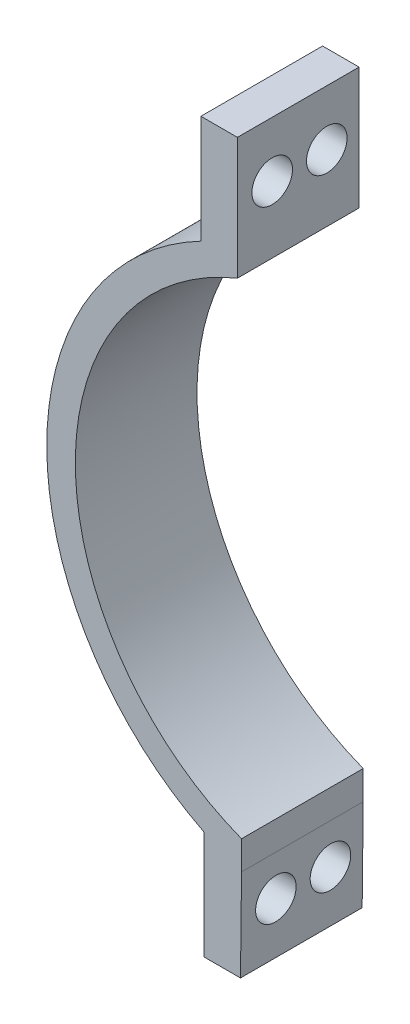
ISO-10303-21;
HEADER;
FILE_DESCRIPTION(('STEP AP214'),'2;1');
FILE_NAME('part.step','',(''),(''),'','','');
FILE_SCHEMA(('AUTOMOTIVE_DESIGN { 1 0 10303 214 1 1 1 1 }'));
ENDSEC;
DATA;
#1=APPLICATION_CONTEXT('core data for automotive mechanical design processes');
#2=APPLICATION_PROTOCOL_DEFINITION('international standard','automotive_design',2000,#1);
#3=PRODUCT_CONTEXT('',#1,'mechanical');
#4=PRODUCT('Part','Part','',(#3));
#5=PRODUCT_RELATED_PRODUCT_CATEGORY('part','',(#4));
#6=PRODUCT_DEFINITION_FORMATION('','',#4);
#7=PRODUCT_DEFINITION_CONTEXT('part definition',#1,'design');
#8=PRODUCT_DEFINITION('design','',#6,#7);
#9=PRODUCT_DEFINITION_SHAPE('','',#8);
#10=(LENGTH_UNIT() NAMED_UNIT(*) SI_UNIT(.MILLI.,.METRE.));
#11=(NAMED_UNIT(*) PLANE_ANGLE_UNIT() SI_UNIT($,.RADIAN.));
#12=(NAMED_UNIT(*) SI_UNIT($,.STERADIAN.) SOLID_ANGLE_UNIT());
#13=UNCERTAINTY_MEASURE_WITH_UNIT(LENGTH_MEASURE(1.E-05),#10,'distance_accuracy_value','');
#14=(GEOMETRIC_REPRESENTATION_CONTEXT(3) GLOBAL_UNCERTAINTY_ASSIGNED_CONTEXT((#13)) GLOBAL_UNIT_ASSIGNED_CONTEXT((#10,
#11,#12)) REPRESENTATION_CONTEXT('',''));
#15=CARTESIAN_POINT('',(0.,0.,0.));
#16=DIRECTION('',(0.,0.,1.));
#17=DIRECTION('',(1.,0.,0.));
#18=AXIS2_PLACEMENT_3D('',#15,#16,#17);
#19=CARTESIAN_POINT('',(35.5888420719883,-3.97670315717924,45.));
#20=DIRECTION('',(0.,0.,-1.));
#21=DIRECTION('',(-1.,0.,0.));
#22=AXIS2_PLACEMENT_3D('',#19,#20,#21);
#23=CYLINDRICAL_SURFACE('',#22,106.085293360055);
#24=CARTESIAN_POINT('',(35.5888420719883,-3.97670315717924,0.));
#25=DIRECTION('',(0.,0.,1.));
#26=DIRECTION('',(-1.,0.,0.));
#27=AXIS2_PLACEMENT_3D('',#24,#25,#26);
#28=CIRCLE('',#27,106.085293360055);
#29=CARTESIAN_POINT('',(-13.5,90.0678344370919,0.));
#30=VERTEX_POINT('',#29);
#31=CARTESIAN_POINT('',(-12.3617913335227,-98.6066467442869,0.));
#32=VERTEX_POINT('',#31);
#33=EDGE_CURVE('E146',#30,#32,#28,.T.);
#34=ORIENTED_EDGE('',*,*,#33,.T.);
#35=DIRECTION('',(0.,0.,-1.));
#36=VECTOR('',#35,1.);
#37=CARTESIAN_POINT('',(-12.3617913335227,-98.6066467442869,45.));
#38=LINE('',#37,#36);
#39=CARTESIAN_POINT('',(-12.3617913335227,-98.6066467442869,45.));
#40=VERTEX_POINT('',#39);
#41=EDGE_CURVE('E189',#40,#32,#38,.T.);
#42=ORIENTED_EDGE('',*,*,#41,.F.);
#43=CARTESIAN_POINT('',(35.5888420719883,-3.97670315717924,45.));
#44=DIRECTION('',(0.,0.,1.));
#45=DIRECTION('',(-1.,0.,0.));
#46=AXIS2_PLACEMENT_3D('',#43,#44,#45);
#47=CIRCLE('',#46,106.085293360055);
#48=CARTESIAN_POINT('',(-13.5,90.0678344370919,45.));
#49=VERTEX_POINT('',#48);
#50=EDGE_CURVE('E59',#49,#40,#47,.T.);
#51=ORIENTED_EDGE('',*,*,#50,.F.);
#52=DIRECTION('',(0.,0.,1.));
#53=VECTOR('',#52,1.);
#54=CARTESIAN_POINT('',(-13.5,90.0678344370919,0.));
#55=LINE('',#54,#53);
#56=EDGE_CURVE('E64',#30,#49,#55,.T.);
#57=ORIENTED_EDGE('',*,*,#56,.F.);
#58=EDGE_LOOP('',(#34,#42,#51,#57));
#59=FACE_BOUND('',#58,.T.);
#60=ADVANCED_FACE('F43',(#59),#23,.T.);
#61=CARTESIAN_POINT('',(1.52939309941136,-104.44581981983,45.));
#62=DIRECTION('',(-1.,0.,0.));
#63=DIRECTION('',(0.,-1.,0.));
#64=AXIS2_PLACEMENT_3D('',#61,#62,#63);
#65=PLANE('',#64);
#66=DIRECTION('',(0.,1.,0.));
#67=VECTOR('',#66,1.);
#68=CARTESIAN_POINT('',(1.52939309941136,-104.44581981983,0.));
#69=LINE('',#68,#67);
#70=CARTESIAN_POINT('',(1.52939309941136,-104.44581981983,0.));
#71=VERTEX_POINT('',#70);
#72=CARTESIAN_POINT('',(1.52939309941136,-93.8133623533498,0.));
#73=VERTEX_POINT('',#72);
#74=EDGE_CURVE('E148',#71,#73,#69,.T.);
#75=ORIENTED_EDGE('',*,*,#74,.T.);
#76=DIRECTION('',(0.,0.,-1.));
#77=VECTOR('',#76,1.);
#78=CARTESIAN_POINT('',(1.52939309941136,-93.8133623533498,45.));
#79=LINE('',#78,#77);
#80=CARTESIAN_POINT('',(1.52939309941136,-93.8133623533498,45.));
#81=VERTEX_POINT('',#80);
#82=EDGE_CURVE('E51',#81,#73,#79,.T.);
#83=ORIENTED_EDGE('',*,*,#82,.F.);
#84=DIRECTION('',(0.,1.,0.));
#85=VECTOR('',#84,1.);
#86=CARTESIAN_POINT('',(1.52939309941136,-104.44581981983,45.));
#87=LINE('',#86,#85);
#88=CARTESIAN_POINT('',(1.52939309941136,-104.44581981983,45.));
#89=VERTEX_POINT('',#88);
#90=EDGE_CURVE('E126',#89,#81,#87,.T.);
#91=ORIENTED_EDGE('',*,*,#90,.F.);
#92=DIRECTION('',(0.,0.,-1.));
#93=VECTOR('',#92,1.);
#94=CARTESIAN_POINT('',(1.52939309941136,-104.44581981983,45.));
#95=LINE('',#94,#93);
#96=EDGE_CURVE('E11',#89,#71,#95,.T.);
#97=ORIENTED_EDGE('',*,*,#96,.T.);
#98=EDGE_LOOP('',(#75,#83,#91,#97));
#99=FACE_BOUND('',#98,.T.);
#100=ADVANCED_FACE('F133',(#99),#65,.F.);
#101=CARTESIAN_POINT('',(36.2162478995864,-4.13293751344085,45.));
#102=DIRECTION('',(0.,0.,-1.));
#103=DIRECTION('',(-1.,0.,0.));
#104=AXIS2_PLACEMENT_3D('',#101,#102,#103);
#105=CYLINDRICAL_SURFACE('',#104,96.1548568476651);
#106=CARTESIAN_POINT('',(36.2162478995864,-4.13293751344085,0.));
#107=DIRECTION('',(0.,0.,-1.));
#108=DIRECTION('',(-1.,0.,0.));
#109=AXIS2_PLACEMENT_3D('',#106,#107,#108);
#110=CIRCLE('',#109,96.1548568476651);
#111=CARTESIAN_POINT('',(0.,84.9408514677779,0.));
#112=VERTEX_POINT('',#111);
#113=EDGE_CURVE('E150',#73,#112,#110,.T.);
#114=ORIENTED_EDGE('',*,*,#113,.T.);
#115=DIRECTION('',(0.,0.,-1.));
#116=VECTOR('',#115,1.);
#117=CARTESIAN_POINT('',(0.,84.9408514677779,45.));
#118=LINE('',#117,#116);
#119=CARTESIAN_POINT('',(0.,84.9408514677779,45.));
#120=VERTEX_POINT('',#119);
#121=EDGE_CURVE('E145',#120,#112,#118,.T.);
#122=ORIENTED_EDGE('',*,*,#121,.F.);
#123=CARTESIAN_POINT('',(36.2162478995864,-4.13293751344085,45.));
#124=DIRECTION('',(0.,0.,-1.));
#125=DIRECTION('',(-1.,0.,0.));
#126=AXIS2_PLACEMENT_3D('',#123,#124,#125);
#127=CIRCLE('',#126,96.1548568476651);
#128=EDGE_CURVE('E136',#81,#120,#127,.T.);
#129=ORIENTED_EDGE('',*,*,#128,.F.);
#130=ORIENTED_EDGE('',*,*,#82,.T.);
#131=EDGE_LOOP('',(#114,#122,#129,#130));
#132=FACE_BOUND('',#131,.T.);
#133=ADVANCED_FACE('F229',(#132),#105,.F.);
#134=CARTESIAN_POINT('',(0.,84.9408514677779,45.));
#135=DIRECTION('',(-1.,0.,0.));
#136=DIRECTION('',(0.,-1.,0.));
#137=AXIS2_PLACEMENT_3D('',#134,#135,#136);
#138=PLANE('',#137);
#139=CARTESIAN_POINT('',(0.,109.597018441893,11.9443933974436));
#140=DIRECTION('',(-1.,0.,0.));
#141=DIRECTION('',(0.,-1.,0.));
#142=AXIS2_PLACEMENT_3D('',#139,#140,#141);
#143=CIRCLE('',#142,7.50000000000001);
#144=CARTESIAN_POINT('',(0.,102.097018441893,11.9443933974436));
#145=VERTEX_POINT('',#144);
#146=EDGE_CURVE('E176',#145,#145,#143,.T.);
#147=ORIENTED_EDGE('',*,*,#146,.T.);
#148=EDGE_LOOP('',(#147));
#149=FACE_BOUND('',#148,.T.);
#150=CARTESIAN_POINT('',(0.,109.597018441893,32.1334757725305));
#151=DIRECTION('',(-1.,0.,0.));
#152=DIRECTION('',(0.,-1.,0.));
#153=AXIS2_PLACEMENT_3D('',#150,#151,#152);
#154=CIRCLE('',#153,7.50000000000001);
#155=CARTESIAN_POINT('',(0.,102.097018441893,32.1334757725305));
#156=VERTEX_POINT('',#155);
#157=EDGE_CURVE('E165',#156,#156,#154,.T.);
#158=ORIENTED_EDGE('',*,*,#157,.T.);
#159=EDGE_LOOP('',(#158));
#160=FACE_BOUND('',#159,.T.);
#161=DIRECTION('',(0.,1.,0.));
#162=VECTOR('',#161,1.);
#163=CARTESIAN_POINT('',(0.,84.9408514677779,0.));
#164=LINE('',#163,#162);
#165=CARTESIAN_POINT('',(0.,130.067834437092,0.));
#166=VERTEX_POINT('',#165);
#167=EDGE_CURVE('E140',#112,#166,#164,.T.);
#168=ORIENTED_EDGE('',*,*,#167,.T.);
#169=DIRECTION('',(0.,0.,1.));
#170=VECTOR('',#169,1.);
#171=CARTESIAN_POINT('',(0.,130.067834437092,0.));
#172=LINE('',#171,#170);
#173=CARTESIAN_POINT('',(0.,130.067834437092,45.));
#174=VERTEX_POINT('',#173);
#175=EDGE_CURVE('E201',#166,#174,#172,.T.);
#176=ORIENTED_EDGE('',*,*,#175,.T.);
#177=DIRECTION('',(0.,1.,0.));
#178=VECTOR('',#177,1.);
#179=CARTESIAN_POINT('',(0.,84.9408514677779,45.));
#180=LINE('',#179,#178);
#181=EDGE_CURVE('E138',#120,#174,#180,.T.);
#182=ORIENTED_EDGE('',*,*,#181,.F.);
#183=ORIENTED_EDGE('',*,*,#121,.T.);
#184=EDGE_LOOP('',(#168,#176,#182,#183));
#185=FACE_BOUND('',#184,.T.);
#186=ADVANCED_FACE('F225',(#149,#160,#185),#138,.F.);
#187=CARTESIAN_POINT('',(35.5888420719883,-3.97670315717924,45.));
#188=DIRECTION('',(0.,0.,-1.));
#189=DIRECTION('',(-1.,0.,0.));
#190=AXIS2_PLACEMENT_3D('',#187,#188,#189);
#191=PLANE('',#190);
#192=ORIENTED_EDGE('',*,*,#50,.T.);
#193=DIRECTION('',(0.,1.,0.));
#194=VECTOR('',#193,1.);
#195=CARTESIAN_POINT('',(-12.3617913335227,-98.6066467442869,45.));
#196=LINE('',#195,#194);
#197=CARTESIAN_POINT('',(-12.3617913335226,-138.606646744287,45.));
#198=VERTEX_POINT('',#197);
#199=EDGE_CURVE('E180',#198,#40,#196,.T.);
#200=ORIENTED_EDGE('',*,*,#199,.F.);
#201=DIRECTION('',(-1.,0.,0.));
#202=VECTOR('',#201,1.);
#203=CARTESIAN_POINT('',(-12.3617913335226,-138.606646744287,45.));
#204=LINE('',#203,#202);
#205=CARTESIAN_POINT('',(1.13820866647736,-138.606646744287,45.));
#206=VERTEX_POINT('',#205);
#207=EDGE_CURVE('E130',#206,#198,#204,.T.);
#208=ORIENTED_EDGE('',*,*,#207,.F.);
#209=DIRECTION('',(-0.0114505069815476,-0.999934440795928,0.));
#210=VECTOR('',#209,1.);
#211=CARTESIAN_POINT('',(1.13820866647736,-138.606646744287,45.));
#212=LINE('',#211,#210);
#213=EDGE_CURVE('E117',#89,#206,#212,.T.);
#214=ORIENTED_EDGE('',*,*,#213,.F.);
#215=ORIENTED_EDGE('',*,*,#90,.T.);
#216=ORIENTED_EDGE('',*,*,#128,.T.);
#217=ORIENTED_EDGE('',*,*,#181,.T.);
#218=DIRECTION('',(1.,0.,0.));
#219=VECTOR('',#218,1.);
#220=CARTESIAN_POINT('',(-13.5,130.067834437092,45.));
#221=LINE('',#220,#219);
#222=CARTESIAN_POINT('',(-13.5,130.067834437092,45.));
#223=VERTEX_POINT('',#222);
#224=EDGE_CURVE('E198',#223,#174,#221,.T.);
#225=ORIENTED_EDGE('',*,*,#224,.F.);
#226=DIRECTION('',(0.,1.,0.));
#227=VECTOR('',#226,1.);
#228=CARTESIAN_POINT('',(-13.5,90.0678344370919,45.));
#229=LINE('',#228,#227);
#230=EDGE_CURVE('E191',#49,#223,#229,.T.);
#231=ORIENTED_EDGE('',*,*,#230,.F.);
#232=EDGE_LOOP('',(#192,#200,#208,#214,#215,#216,#217,#225,#231));
#233=FACE_BOUND('',#232,.T.);
#234=ADVANCED_FACE('F125',(#233),#191,.F.);
#235=CARTESIAN_POINT('',(35.5888420719883,-3.97670315717924,0.));
#236=DIRECTION('',(0.,0.,-1.));
#237=DIRECTION('',(-1.,0.,0.));
#238=AXIS2_PLACEMENT_3D('',#235,#236,#237);
#239=PLANE('',#238);
#240=ORIENTED_EDGE('',*,*,#74,.F.);
#241=DIRECTION('',(-0.0114505069815476,-0.999934440795928,0.));
#242=VECTOR('',#241,1.);
#243=CARTESIAN_POINT('',(1.13820866647736,-138.606646744287,0.));
#244=LINE('',#243,#242);
#245=CARTESIAN_POINT('',(1.13820866647736,-138.606646744287,0.));
#246=VERTEX_POINT('',#245);
#247=EDGE_CURVE('E119',#71,#246,#244,.T.);
#248=ORIENTED_EDGE('',*,*,#247,.T.);
#249=DIRECTION('',(-1.,0.,0.));
#250=VECTOR('',#249,1.);
#251=CARTESIAN_POINT('',(-12.3617913335226,-138.606646744287,0.));
#252=LINE('',#251,#250);
#253=CARTESIAN_POINT('',(-12.3617913335226,-138.606646744287,0.));
#254=VERTEX_POINT('',#253);
#255=EDGE_CURVE('E184',#246,#254,#252,.T.);
#256=ORIENTED_EDGE('',*,*,#255,.T.);
#257=DIRECTION('',(0.,1.,0.));
#258=VECTOR('',#257,1.);
#259=CARTESIAN_POINT('',(-12.3617913335227,-98.6066467442869,0.));
#260=LINE('',#259,#258);
#261=EDGE_CURVE('E131',#254,#32,#260,.T.);
#262=ORIENTED_EDGE('',*,*,#261,.T.);
#263=ORIENTED_EDGE('',*,*,#33,.F.);
#264=DIRECTION('',(0.,1.,0.));
#265=VECTOR('',#264,1.);
#266=CARTESIAN_POINT('',(-13.5,90.0678344370919,0.));
#267=LINE('',#266,#265);
#268=CARTESIAN_POINT('',(-13.5,130.067834437092,0.));
#269=VERTEX_POINT('',#268);
#270=EDGE_CURVE('E195',#30,#269,#267,.T.);
#271=ORIENTED_EDGE('',*,*,#270,.T.);
#272=DIRECTION('',(1.,0.,0.));
#273=VECTOR('',#272,1.);
#274=CARTESIAN_POINT('',(-13.5,130.067834437092,0.));
#275=LINE('',#274,#273);
#276=EDGE_CURVE('E197',#269,#166,#275,.T.);
#277=ORIENTED_EDGE('',*,*,#276,.T.);
#278=ORIENTED_EDGE('',*,*,#167,.F.);
#279=ORIENTED_EDGE('',*,*,#113,.F.);
#280=EDGE_LOOP('',(#240,#248,#256,#262,#263,#271,#277,#278,#279));
#281=FACE_BOUND('',#280,.T.);
#282=ADVANCED_FACE('F215',(#281),#239,.T.);
#283=CARTESIAN_POINT('',(-13.5,90.0678344370919,0.));
#284=DIRECTION('',(1.,0.,0.));
#285=DIRECTION('',(0.,1.,0.));
#286=AXIS2_PLACEMENT_3D('',#283,#284,#285);
#287=PLANE('',#286);
#288=CARTESIAN_POINT('',(-13.5,109.597018441893,11.9443933974436));
#289=DIRECTION('',(1.,0.,0.));
#290=DIRECTION('',(0.,1.,0.));
#291=AXIS2_PLACEMENT_3D('',#288,#289,#290);
#292=CIRCLE('',#291,7.50000000000001);
#293=CARTESIAN_POINT('',(-13.5,117.097018441893,11.9443933974436));
#294=VERTEX_POINT('',#293);
#295=EDGE_CURVE('E46',#294,#294,#292,.T.);
#296=ORIENTED_EDGE('',*,*,#295,.T.);
#297=EDGE_LOOP('',(#296));
#298=FACE_BOUND('',#297,.T.);
#299=CARTESIAN_POINT('',(-13.5,109.597018441893,32.1334757725305));
#300=DIRECTION('',(1.,0.,0.));
#301=DIRECTION('',(0.,1.,0.));
#302=AXIS2_PLACEMENT_3D('',#299,#300,#301);
#303=CIRCLE('',#302,7.50000000000001);
#304=CARTESIAN_POINT('',(-13.5,117.097018441893,32.1334757725305));
#305=VERTEX_POINT('',#304);
#306=EDGE_CURVE('E163',#305,#305,#303,.T.);
#307=ORIENTED_EDGE('',*,*,#306,.T.);
#308=EDGE_LOOP('',(#307));
#309=FACE_BOUND('',#308,.T.);
#310=ORIENTED_EDGE('',*,*,#230,.T.);
#311=DIRECTION('',(0.,0.,1.));
#312=VECTOR('',#311,1.);
#313=CARTESIAN_POINT('',(-13.5,130.067834437092,0.));
#314=LINE('',#313,#312);
#315=EDGE_CURVE('E207',#269,#223,#314,.T.);
#316=ORIENTED_EDGE('',*,*,#315,.F.);
#317=ORIENTED_EDGE('',*,*,#270,.F.);
#318=ORIENTED_EDGE('',*,*,#56,.T.);
#319=EDGE_LOOP('',(#310,#316,#317,#318));
#320=FACE_BOUND('',#319,.T.);
#321=ADVANCED_FACE('F211',(#298,#309,#320),#287,.F.);
#322=CARTESIAN_POINT('',(-13.5,130.067834437092,0.));
#323=DIRECTION('',(0.,-1.,0.));
#324=DIRECTION('',(0.,0.,-1.));
#325=AXIS2_PLACEMENT_3D('',#322,#323,#324);
#326=PLANE('',#325);
#327=ORIENTED_EDGE('',*,*,#224,.T.);
#328=ORIENTED_EDGE('',*,*,#175,.F.);
#329=ORIENTED_EDGE('',*,*,#276,.F.);
#330=ORIENTED_EDGE('',*,*,#315,.T.);
#331=EDGE_LOOP('',(#327,#328,#329,#330));
#332=FACE_BOUND('',#331,.T.);
#333=ADVANCED_FACE('F223',(#332),#326,.F.);
#334=CARTESIAN_POINT('',(-12.3617913335227,-98.6066467442869,45.));
#335=DIRECTION('',(-1.,0.,0.));
#336=DIRECTION('',(0.,-1.,0.));
#337=AXIS2_PLACEMENT_3D('',#334,#335,#336);
#338=PLANE('',#337);
#339=CARTESIAN_POINT('',(-12.3617913335226,-119.481769574094,32.1334757725305));
#340=DIRECTION('',(-1.,0.,0.));
#341=DIRECTION('',(0.,-1.,0.));
#342=AXIS2_PLACEMENT_3D('',#339,#340,#341);
#343=CIRCLE('',#342,7.50000000000001);
#344=CARTESIAN_POINT('',(-12.3617913335226,-126.981769574094,32.1334757725305));
#345=VERTEX_POINT('',#344);
#346=EDGE_CURVE('E162',#345,#345,#343,.T.);
#347=ORIENTED_EDGE('',*,*,#346,.F.);
#348=EDGE_LOOP('',(#347));
#349=FACE_BOUND('',#348,.T.);
#350=CARTESIAN_POINT('',(-12.3617913335226,-119.481769574094,11.9443933974436));
#351=DIRECTION('',(-1.,0.,0.));
#352=DIRECTION('',(0.,-1.,0.));
#353=AXIS2_PLACEMENT_3D('',#350,#351,#352);
#354=CIRCLE('',#353,7.50000000000007);
#355=CARTESIAN_POINT('',(-12.3617913335226,-126.981769574094,11.9443933974436));
#356=VERTEX_POINT('',#355);
#357=EDGE_CURVE('E159',#356,#356,#354,.T.);
#358=ORIENTED_EDGE('',*,*,#357,.F.);
#359=EDGE_LOOP('',(#358));
#360=FACE_BOUND('',#359,.T.);
#361=ORIENTED_EDGE('',*,*,#261,.F.);
#362=DIRECTION('',(0.,0.,-1.));
#363=VECTOR('',#362,1.);
#364=CARTESIAN_POINT('',(-12.3617913335226,-138.606646744287,45.));
#365=LINE('',#364,#363);
#366=EDGE_CURVE('E192',#198,#254,#365,.T.);
#367=ORIENTED_EDGE('',*,*,#366,.F.);
#368=ORIENTED_EDGE('',*,*,#199,.T.);
#369=ORIENTED_EDGE('',*,*,#41,.T.);
#370=EDGE_LOOP('',(#361,#367,#368,#369));
#371=FACE_BOUND('',#370,.T.);
#372=ADVANCED_FACE('F291',(#349,#360,#371),#338,.T.);
#373=CARTESIAN_POINT('',(-12.3617913335226,-138.606646744287,45.));
#374=DIRECTION('',(0.,-1.,0.));
#375=DIRECTION('',(0.,0.,-1.));
#376=AXIS2_PLACEMENT_3D('',#373,#374,#375);
#377=PLANE('',#376);
#378=ORIENTED_EDGE('',*,*,#255,.F.);
#379=DIRECTION('',(0.,0.,-1.));
#380=VECTOR('',#379,1.);
#381=CARTESIAN_POINT('',(1.13820866647736,-138.606646744287,45.));
#382=LINE('',#381,#380);
#383=EDGE_CURVE('E182',#206,#246,#382,.T.);
#384=ORIENTED_EDGE('',*,*,#383,.F.);
#385=ORIENTED_EDGE('',*,*,#207,.T.);
#386=ORIENTED_EDGE('',*,*,#366,.T.);
#387=EDGE_LOOP('',(#378,#384,#385,#386));
#388=FACE_BOUND('',#387,.T.);
#389=ADVANCED_FACE('F299',(#388),#377,.T.);
#390=CARTESIAN_POINT('',(1.13820866647736,-138.606646744287,45.));
#391=DIRECTION('',(0.999934440795928,-0.0114505069815476,0.));
#392=DIRECTION('',(0.0114505069815476,0.999934440795928,0.));
#393=AXIS2_PLACEMENT_3D('',#390,#391,#392);
#394=PLANE('',#393);
#395=CARTESIAN_POINT('',(1.35721256375709,-119.481769574094,32.1334757725305));
#396=DIRECTION('',(0.999934440795928,-0.0114505069815476,0.));
#397=DIRECTION('',(-0.0114505069815476,-0.999934440795928,0.));
#398=AXIS2_PLACEMENT_3D('',#395,#396,#397);
#399=ELLIPSE('',#398,7.50049172626773,7.50000000000001);
#400=CARTESIAN_POINT('',(1.27132813088042,-126.981769574094,32.1334757725305));
#401=VERTEX_POINT('',#400);
#402=EDGE_CURVE('E160',#401,#401,#399,.T.);
#403=ORIENTED_EDGE('',*,*,#402,.F.);
#404=EDGE_LOOP('',(#403));
#405=FACE_BOUND('',#404,.T.);
#406=CARTESIAN_POINT('',(1.35721256375709,-119.481769574094,11.9443933974436));
#407=DIRECTION('',(0.999934440795928,-0.0114505069815476,0.));
#408=DIRECTION('',(-0.0114505069815476,-0.999934440795928,0.));
#409=AXIS2_PLACEMENT_3D('',#406,#407,#408);
#410=ELLIPSE('',#409,7.50049172626779,7.50000000000007);
#411=CARTESIAN_POINT('',(1.27132813088042,-126.981769574094,11.9443933974436));
#412=VERTEX_POINT('',#411);
#413=EDGE_CURVE('E156',#412,#412,#410,.T.);
#414=ORIENTED_EDGE('',*,*,#413,.F.);
#415=EDGE_LOOP('',(#414));
#416=FACE_BOUND('',#415,.T.);
#417=ORIENTED_EDGE('',*,*,#247,.F.);
#418=ORIENTED_EDGE('',*,*,#96,.F.);
#419=ORIENTED_EDGE('',*,*,#213,.T.);
#420=ORIENTED_EDGE('',*,*,#383,.T.);
#421=EDGE_LOOP('',(#417,#418,#419,#420));
#422=FACE_BOUND('',#421,.T.);
#423=ADVANCED_FACE('F116',(#405,#416,#422),#394,.T.);
#424=CARTESIAN_POINT('',(30.1382086664773,-119.481769574094,11.9443933974436));
#425=DIRECTION('',(-1.,0.,0.));
#426=DIRECTION('',(0.,-1.,0.));
#427=AXIS2_PLACEMENT_3D('',#424,#425,#426);
#428=CYLINDRICAL_SURFACE('',#427,7.50000000000007);
#429=ORIENTED_EDGE('',*,*,#357,.T.);
#430=EDGE_LOOP('',(#429));
#431=FACE_BOUND('',#430,.T.);
#432=ORIENTED_EDGE('',*,*,#413,.T.);
#433=EDGE_LOOP('',(#432));
#434=FACE_BOUND('',#433,.T.);
#435=ADVANCED_FACE('F316',(#431,#434),#428,.F.);
#436=CARTESIAN_POINT('',(30.1382086664773,-119.481769574094,32.1334757725305));
#437=DIRECTION('',(-1.,0.,0.));
#438=DIRECTION('',(0.,-1.,0.));
#439=AXIS2_PLACEMENT_3D('',#436,#437,#438);
#440=CYLINDRICAL_SURFACE('',#439,7.50000000000001);
#441=ORIENTED_EDGE('',*,*,#346,.T.);
#442=EDGE_LOOP('',(#441));
#443=FACE_BOUND('',#442,.T.);
#444=ORIENTED_EDGE('',*,*,#402,.T.);
#445=EDGE_LOOP('',(#444));
#446=FACE_BOUND('',#445,.T.);
#447=ADVANCED_FACE('F329',(#443,#446),#440,.F.);
#448=CARTESIAN_POINT('',(30.1382086664773,109.597018441893,32.1334757725305));
#449=DIRECTION('',(-1.,0.,0.));
#450=DIRECTION('',(0.,-1.,0.));
#451=AXIS2_PLACEMENT_3D('',#448,#449,#450);
#452=CYLINDRICAL_SURFACE('',#451,7.50000000000001);
#453=ORIENTED_EDGE('',*,*,#306,.F.);
#454=EDGE_LOOP('',(#453));
#455=FACE_BOUND('',#454,.T.);
#456=ORIENTED_EDGE('',*,*,#157,.F.);
#457=EDGE_LOOP('',(#456));
#458=FACE_BOUND('',#457,.T.);
#459=ADVANCED_FACE('F338',(#455,#458),#452,.F.);
#460=CARTESIAN_POINT('',(30.1382086664773,109.597018441893,11.9443933974436));
#461=DIRECTION('',(-1.,0.,0.));
#462=DIRECTION('',(0.,-1.,0.));
#463=AXIS2_PLACEMENT_3D('',#460,#461,#462);
#464=CYLINDRICAL_SURFACE('',#463,7.50000000000001);
#465=ORIENTED_EDGE('',*,*,#295,.F.);
#466=EDGE_LOOP('',(#465));
#467=FACE_BOUND('',#466,.T.);
#468=ORIENTED_EDGE('',*,*,#146,.F.);
#469=EDGE_LOOP('',(#468));
#470=FACE_BOUND('',#469,.T.);
#471=ADVANCED_FACE('F346',(#467,#470),#464,.F.);
#472=CLOSED_SHELL('',(#60,#100,#133,#186,#234,#282,#321,#333,#372,#389,#423,#435,#447,#459,#471));
#473=MANIFOLD_SOLID_BREP('B2',#472);
#474=ADVANCED_BREP_SHAPE_REPRESENTATION('',(#18,#473),#14);
#475=SHAPE_DEFINITION_REPRESENTATION(#9,#474);
ENDSEC;
END-ISO-10303-21;
